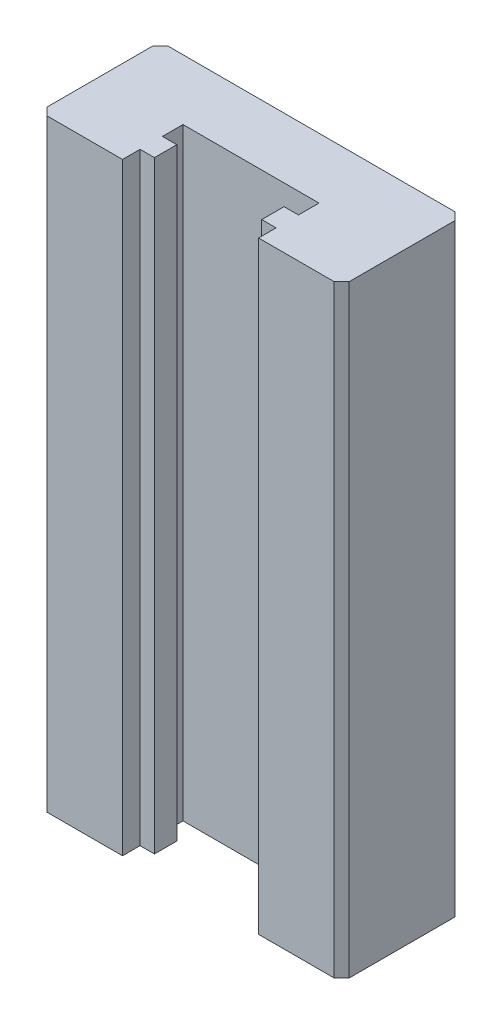
ISO-10303-21;
HEADER;
FILE_DESCRIPTION(('STEP AP214'),'2;1');
FILE_NAME('part.step','',(''),(''),'','','');
FILE_SCHEMA(('AUTOMOTIVE_DESIGN { 1 0 10303 214 1 1 1 1 }'));
ENDSEC;
DATA;
#1=APPLICATION_CONTEXT('core data for automotive mechanical design processes');
#2=APPLICATION_PROTOCOL_DEFINITION('international standard','automotive_design',2000,#1);
#3=PRODUCT_CONTEXT('',#1,'mechanical');
#4=PRODUCT('Part','Part','',(#3));
#5=PRODUCT_RELATED_PRODUCT_CATEGORY('part','',(#4));
#6=PRODUCT_DEFINITION_FORMATION('','',#4);
#7=PRODUCT_DEFINITION_CONTEXT('part definition',#1,'design');
#8=PRODUCT_DEFINITION('design','',#6,#7);
#9=PRODUCT_DEFINITION_SHAPE('','',#8);
#10=(LENGTH_UNIT() NAMED_UNIT(*) SI_UNIT(.MILLI.,.METRE.));
#11=(NAMED_UNIT(*) PLANE_ANGLE_UNIT() SI_UNIT($,.RADIAN.));
#12=(NAMED_UNIT(*) SI_UNIT($,.STERADIAN.) SOLID_ANGLE_UNIT());
#13=UNCERTAINTY_MEASURE_WITH_UNIT(LENGTH_MEASURE(1.E-05),#10,'distance_accuracy_value','');
#14=(GEOMETRIC_REPRESENTATION_CONTEXT(3) GLOBAL_UNCERTAINTY_ASSIGNED_CONTEXT((#13)) GLOBAL_UNIT_ASSIGNED_CONTEXT((#10,
#11,#12)) REPRESENTATION_CONTEXT('',''));
#15=CARTESIAN_POINT('',(0.,0.,0.));
#16=DIRECTION('',(0.,0.,1.));
#17=DIRECTION('',(1.,0.,0.));
#18=AXIS2_PLACEMENT_3D('',#15,#16,#17);
#19=CARTESIAN_POINT('',(4.5,39.9,0.));
#20=DIRECTION('',(-1.,0.,0.));
#21=DIRECTION('',(0.,0.,1.));
#22=AXIS2_PLACEMENT_3D('',#19,#20,#21);
#23=PLANE('',#22);
#24=DIRECTION('',(0.,0.,-1.));
#25=VECTOR('',#24,1.);
#26=CARTESIAN_POINT('',(4.5,0.,0.));
#27=LINE('',#26,#25);
#28=CARTESIAN_POINT('',(4.5,0.,1.36));
#29=VERTEX_POINT('',#28);
#30=CARTESIAN_POINT('',(4.5,0.,0.));
#31=VERTEX_POINT('',#30);
#32=EDGE_CURVE('E191',#29,#31,#27,.T.);
#33=ORIENTED_EDGE('',*,*,#32,.F.);
#34=DIRECTION('',(0.,-1.,0.));
#35=VECTOR('',#34,1.);
#36=CARTESIAN_POINT('',(4.5,39.9,1.36));
#37=LINE('',#36,#35);
#38=CARTESIAN_POINT('',(4.5,39.9,1.36));
#39=VERTEX_POINT('',#38);
#40=EDGE_CURVE('E187',#39,#29,#37,.T.);
#41=ORIENTED_EDGE('',*,*,#40,.F.);
#42=DIRECTION('',(0.,0.,-1.));
#43=VECTOR('',#42,1.);
#44=CARTESIAN_POINT('',(4.5,39.9,0.));
#45=LINE('',#44,#43);
#46=CARTESIAN_POINT('',(4.5,39.9,0.));
#47=VERTEX_POINT('',#46);
#48=EDGE_CURVE('E189',#39,#47,#45,.T.);
#49=ORIENTED_EDGE('',*,*,#48,.T.);
#50=DIRECTION('',(0.,-1.,0.));
#51=VECTOR('',#50,1.);
#52=CARTESIAN_POINT('',(4.5,39.9,0.));
#53=LINE('',#52,#51);
#54=EDGE_CURVE('E260',#47,#31,#53,.T.);
#55=ORIENTED_EDGE('',*,*,#54,.T.);
#56=EDGE_LOOP('',(#33,#41,#49,#55));
#57=FACE_BOUND('',#56,.T.);
#58=ADVANCED_FACE('F47',(#57),#23,.T.);
#59=CARTESIAN_POINT('',(0.,39.9,1.36));
#60=DIRECTION('',(0.,0.,-1.));
#61=DIRECTION('',(-1.,0.,0.));
#62=AXIS2_PLACEMENT_3D('',#59,#60,#61);
#63=PLANE('',#62);
#64=DIRECTION('',(1.,0.,0.));
#65=VECTOR('',#64,1.);
#66=CARTESIAN_POINT('',(0.,0.,1.36));
#67=LINE('',#66,#65);
#68=CARTESIAN_POINT('',(3.55,0.,1.36));
#69=VERTEX_POINT('',#68);
#70=EDGE_CURVE('E263',#69,#29,#67,.T.);
#71=ORIENTED_EDGE('',*,*,#70,.F.);
#72=DIRECTION('',(0.,-1.,0.));
#73=VECTOR('',#72,1.);
#74=CARTESIAN_POINT('',(3.55,39.9,1.36));
#75=LINE('',#74,#73);
#76=CARTESIAN_POINT('',(3.55,39.9,1.36));
#77=VERTEX_POINT('',#76);
#78=EDGE_CURVE('E198',#77,#69,#75,.T.);
#79=ORIENTED_EDGE('',*,*,#78,.F.);
#80=DIRECTION('',(1.,0.,0.));
#81=VECTOR('',#80,1.);
#82=CARTESIAN_POINT('',(0.,39.9,1.36));
#83=LINE('',#82,#81);
#84=EDGE_CURVE('E204',#77,#39,#83,.T.);
#85=ORIENTED_EDGE('',*,*,#84,.T.);
#86=ORIENTED_EDGE('',*,*,#40,.T.);
#87=EDGE_LOOP('',(#71,#79,#85,#86));
#88=FACE_BOUND('',#87,.T.);
#89=ADVANCED_FACE('F212',(#88),#63,.T.);
#90=CARTESIAN_POINT('',(3.55,39.9,0.));
#91=DIRECTION('',(-1.,0.,0.));
#92=DIRECTION('',(0.,0.,1.));
#93=AXIS2_PLACEMENT_3D('',#90,#91,#92);
#94=PLANE('',#93);
#95=DIRECTION('',(0.,0.,-1.));
#96=VECTOR('',#95,1.);
#97=CARTESIAN_POINT('',(3.55,0.,0.));
#98=LINE('',#97,#96);
#99=CARTESIAN_POINT('',(3.55,0.,2.84));
#100=VERTEX_POINT('',#99);
#101=EDGE_CURVE('E267',#100,#69,#98,.T.);
#102=ORIENTED_EDGE('',*,*,#101,.F.);
#103=DIRECTION('',(0.,-1.,0.));
#104=VECTOR('',#103,1.);
#105=CARTESIAN_POINT('',(3.55,39.9,2.84));
#106=LINE('',#105,#104);
#107=CARTESIAN_POINT('',(3.55,39.9,2.84));
#108=VERTEX_POINT('',#107);
#109=EDGE_CURVE('E346',#108,#100,#106,.T.);
#110=ORIENTED_EDGE('',*,*,#109,.F.);
#111=DIRECTION('',(0.,0.,-1.));
#112=VECTOR('',#111,1.);
#113=CARTESIAN_POINT('',(3.55,39.9,0.));
#114=LINE('',#113,#112);
#115=EDGE_CURVE('E214',#108,#77,#114,.T.);
#116=ORIENTED_EDGE('',*,*,#115,.T.);
#117=ORIENTED_EDGE('',*,*,#78,.T.);
#118=EDGE_LOOP('',(#102,#110,#116,#117));
#119=FACE_BOUND('',#118,.T.);
#120=ADVANCED_FACE('F435',(#119),#94,.T.);
#121=CARTESIAN_POINT('',(0.,39.9,2.84));
#122=DIRECTION('',(0.,0.,1.));
#123=DIRECTION('',(1.,0.,0.));
#124=AXIS2_PLACEMENT_3D('',#121,#122,#123);
#125=PLANE('',#124);
#126=DIRECTION('',(-1.,0.,0.));
#127=VECTOR('',#126,1.);
#128=CARTESIAN_POINT('',(0.,0.,2.84));
#129=LINE('',#128,#127);
#130=CARTESIAN_POINT('',(4.5,0.,2.84));
#131=VERTEX_POINT('',#130);
#132=EDGE_CURVE('E271',#131,#100,#129,.T.);
#133=ORIENTED_EDGE('',*,*,#132,.F.);
#134=DIRECTION('',(0.,-1.,0.));
#135=VECTOR('',#134,1.);
#136=CARTESIAN_POINT('',(4.5,39.9,2.84));
#137=LINE('',#136,#135);
#138=CARTESIAN_POINT('',(4.5,39.9,2.84));
#139=VERTEX_POINT('',#138);
#140=EDGE_CURVE('E343',#139,#131,#137,.T.);
#141=ORIENTED_EDGE('',*,*,#140,.F.);
#142=DIRECTION('',(-1.,0.,0.));
#143=VECTOR('',#142,1.);
#144=CARTESIAN_POINT('',(0.,39.9,2.84));
#145=LINE('',#144,#143);
#146=EDGE_CURVE('E217',#139,#108,#145,.T.);
#147=ORIENTED_EDGE('',*,*,#146,.T.);
#148=ORIENTED_EDGE('',*,*,#109,.T.);
#149=EDGE_LOOP('',(#133,#141,#147,#148));
#150=FACE_BOUND('',#149,.T.);
#151=ADVANCED_FACE('F439',(#150),#125,.T.);
#152=CARTESIAN_POINT('',(4.5,39.9,0.));
#153=DIRECTION('',(-1.,0.,0.));
#154=DIRECTION('',(0.,0.,1.));
#155=AXIS2_PLACEMENT_3D('',#152,#153,#154);
#156=PLANE('',#155);
#157=DIRECTION('',(0.,0.,-1.));
#158=VECTOR('',#157,1.);
#159=CARTESIAN_POINT('',(4.5,0.,0.));
#160=LINE('',#159,#158);
#161=CARTESIAN_POINT('',(4.5,0.,4.));
#162=VERTEX_POINT('',#161);
#163=EDGE_CURVE('E275',#162,#131,#160,.T.);
#164=ORIENTED_EDGE('',*,*,#163,.F.);
#165=DIRECTION('',(0.,-1.,0.));
#166=VECTOR('',#165,1.);
#167=CARTESIAN_POINT('',(4.5,39.9,4.));
#168=LINE('',#167,#166);
#169=CARTESIAN_POINT('',(4.5,39.9,4.));
#170=VERTEX_POINT('',#169);
#171=EDGE_CURVE('E340',#170,#162,#168,.T.);
#172=ORIENTED_EDGE('',*,*,#171,.F.);
#173=DIRECTION('',(0.,0.,-1.));
#174=VECTOR('',#173,1.);
#175=CARTESIAN_POINT('',(4.5,39.9,0.));
#176=LINE('',#175,#174);
#177=EDGE_CURVE('E224',#170,#139,#176,.T.);
#178=ORIENTED_EDGE('',*,*,#177,.T.);
#179=ORIENTED_EDGE('',*,*,#140,.T.);
#180=EDGE_LOOP('',(#164,#172,#178,#179));
#181=FACE_BOUND('',#180,.T.);
#182=ADVANCED_FACE('F442',(#181),#156,.T.);
#183=CARTESIAN_POINT('',(0.,39.9,4.));
#184=DIRECTION('',(0.,0.,-1.));
#185=DIRECTION('',(-1.,0.,0.));
#186=AXIS2_PLACEMENT_3D('',#183,#184,#185);
#187=PLANE('',#186);
#188=DIRECTION('',(1.,0.,0.));
#189=VECTOR('',#188,1.);
#190=CARTESIAN_POINT('',(0.,0.,4.));
#191=LINE('',#190,#189);
#192=CARTESIAN_POINT('',(9.49999999999999,0.,4.));
#193=VERTEX_POINT('',#192);
#194=EDGE_CURVE('E279',#162,#193,#191,.T.);
#195=ORIENTED_EDGE('',*,*,#194,.T.);
#196=DIRECTION('',(0.,1.,0.));
#197=VECTOR('',#196,1.);
#198=CARTESIAN_POINT('',(9.49999999999999,39.9,4.));
#199=LINE('',#198,#197);
#200=CARTESIAN_POINT('',(9.49999999999999,39.9,4.));
#201=VERTEX_POINT('',#200);
#202=EDGE_CURVE('E391',#193,#201,#199,.T.);
#203=ORIENTED_EDGE('',*,*,#202,.T.);
#204=DIRECTION('',(1.,0.,0.));
#205=VECTOR('',#204,1.);
#206=CARTESIAN_POINT('',(0.,39.9,4.));
#207=LINE('',#206,#205);
#208=EDGE_CURVE('E228',#170,#201,#207,.T.);
#209=ORIENTED_EDGE('',*,*,#208,.F.);
#210=ORIENTED_EDGE('',*,*,#171,.T.);
#211=EDGE_LOOP('',(#195,#203,#209,#210));
#212=FACE_BOUND('',#211,.T.);
#213=ADVANCED_FACE('F494',(#212),#187,.F.);
#214=CARTESIAN_POINT('',(10.,39.9,0.));
#215=DIRECTION('',(-1.,0.,0.));
#216=DIRECTION('',(0.,0.,1.));
#217=AXIS2_PLACEMENT_3D('',#214,#215,#216);
#218=PLANE('',#217);
#219=DIRECTION('',(0.,0.,-1.));
#220=VECTOR('',#219,1.);
#221=CARTESIAN_POINT('',(10.,39.9,0.));
#222=LINE('',#221,#220);
#223=CARTESIAN_POINT('',(10.,39.9,3.49999999999999));
#224=VERTEX_POINT('',#223);
#225=CARTESIAN_POINT('',(10.,39.9,-3.5));
#226=VERTEX_POINT('',#225);
#227=EDGE_CURVE('E232',#224,#226,#222,.T.);
#228=ORIENTED_EDGE('',*,*,#227,.F.);
#229=DIRECTION('',(0.,-1.,0.));
#230=VECTOR('',#229,1.);
#231=CARTESIAN_POINT('',(10.,39.9,3.49999999999999));
#232=LINE('',#231,#230);
#233=CARTESIAN_POINT('',(10.,0.,3.49999999999999));
#234=VERTEX_POINT('',#233);
#235=EDGE_CURVE('E387',#224,#234,#232,.T.);
#236=ORIENTED_EDGE('',*,*,#235,.T.);
#237=DIRECTION('',(0.,0.,-1.));
#238=VECTOR('',#237,1.);
#239=CARTESIAN_POINT('',(10.,0.,0.));
#240=LINE('',#239,#238);
#241=CARTESIAN_POINT('',(10.,0.,-3.5));
#242=VERTEX_POINT('',#241);
#243=EDGE_CURVE('E283',#234,#242,#240,.T.);
#244=ORIENTED_EDGE('',*,*,#243,.T.);
#245=DIRECTION('',(0.,1.,0.));
#246=VECTOR('',#245,1.);
#247=CARTESIAN_POINT('',(10.,39.9,-3.5));
#248=LINE('',#247,#246);
#249=EDGE_CURVE('E384',#242,#226,#248,.T.);
#250=ORIENTED_EDGE('',*,*,#249,.T.);
#251=EDGE_LOOP('',(#228,#236,#244,#250));
#252=FACE_BOUND('',#251,.T.);
#253=ADVANCED_FACE('F453',(#252),#218,.F.);
#254=CARTESIAN_POINT('',(0.,39.9,-4.));
#255=DIRECTION('',(0.,0.,-1.));
#256=DIRECTION('',(-1.,0.,0.));
#257=AXIS2_PLACEMENT_3D('',#254,#255,#256);
#258=PLANE('',#257);
#259=CARTESIAN_POINT('',(7.5,27.95,-4.));
#260=DIRECTION('',(0.,0.,-1.));
#261=DIRECTION('',(1.,0.,0.));
#262=AXIS2_PLACEMENT_3D('',#259,#260,#261);
#263=CIRCLE('',#262,1.5);
#264=CARTESIAN_POINT('',(9.,27.95,-4.));
#265=VERTEX_POINT('',#264);
#266=EDGE_CURVE('E566',#265,#265,#263,.T.);
#267=ORIENTED_EDGE('',*,*,#266,.F.);
#268=EDGE_LOOP('',(#267));
#269=FACE_BOUND('',#268,.T.);
#270=CARTESIAN_POINT('',(-7.5,11.95,-4.));
#271=DIRECTION('',(0.,0.,-1.));
#272=DIRECTION('',(1.,0.,0.));
#273=AXIS2_PLACEMENT_3D('',#270,#271,#272);
#274=CIRCLE('',#273,1.5);
#275=CARTESIAN_POINT('',(-6.,11.95,-4.));
#276=VERTEX_POINT('',#275);
#277=EDGE_CURVE('E562',#276,#276,#274,.T.);
#278=ORIENTED_EDGE('',*,*,#277,.F.);
#279=EDGE_LOOP('',(#278));
#280=FACE_BOUND('',#279,.T.);
#281=CARTESIAN_POINT('',(7.5,11.95,-4.));
#282=DIRECTION('',(0.,0.,-1.));
#283=DIRECTION('',(-1.,0.,0.));
#284=AXIS2_PLACEMENT_3D('',#281,#282,#283);
#285=CIRCLE('',#284,1.5);
#286=CARTESIAN_POINT('',(6.,11.95,-4.));
#287=VERTEX_POINT('',#286);
#288=EDGE_CURVE('E554',#287,#287,#285,.T.);
#289=ORIENTED_EDGE('',*,*,#288,.F.);
#290=EDGE_LOOP('',(#289));
#291=FACE_BOUND('',#290,.T.);
#292=CARTESIAN_POINT('',(-7.5,27.95,-4.));
#293=DIRECTION('',(0.,0.,-1.));
#294=DIRECTION('',(-1.,0.,0.));
#295=AXIS2_PLACEMENT_3D('',#292,#293,#294);
#296=CIRCLE('',#295,1.5);
#297=CARTESIAN_POINT('',(-9.,27.95,-4.));
#298=VERTEX_POINT('',#297);
#299=EDGE_CURVE('E570',#298,#298,#296,.T.);
#300=ORIENTED_EDGE('',*,*,#299,.F.);
#301=EDGE_LOOP('',(#300));
#302=FACE_BOUND('',#301,.T.);
#303=DIRECTION('',(1.,0.,0.));
#304=VECTOR('',#303,1.);
#305=CARTESIAN_POINT('',(0.,39.9,-4.));
#306=LINE('',#305,#304);
#307=CARTESIAN_POINT('',(-9.49999999999999,39.9,-4.));
#308=VERTEX_POINT('',#307);
#309=CARTESIAN_POINT('',(9.5,39.9,-4.));
#310=VERTEX_POINT('',#309);
#311=EDGE_CURVE('E236',#308,#310,#306,.T.);
#312=ORIENTED_EDGE('',*,*,#311,.T.);
#313=DIRECTION('',(0.,-1.,0.));
#314=VECTOR('',#313,1.);
#315=CARTESIAN_POINT('',(9.5,0.,-4.));
#316=LINE('',#315,#314);
#317=CARTESIAN_POINT('',(9.5,0.,-4.));
#318=VERTEX_POINT('',#317);
#319=EDGE_CURVE('E11',#310,#318,#316,.T.);
#320=ORIENTED_EDGE('',*,*,#319,.T.);
#321=DIRECTION('',(1.,0.,0.));
#322=VECTOR('',#321,1.);
#323=CARTESIAN_POINT('',(0.,0.,-4.));
#324=LINE('',#323,#322);
#325=CARTESIAN_POINT('',(-9.49999999999999,0.,-4.));
#326=VERTEX_POINT('',#325);
#327=EDGE_CURVE('E288',#326,#318,#324,.T.);
#328=ORIENTED_EDGE('',*,*,#327,.F.);
#329=DIRECTION('',(0.,1.,0.));
#330=VECTOR('',#329,1.);
#331=CARTESIAN_POINT('',(-9.49999999999999,39.9,-4.));
#332=LINE('',#331,#330);
#333=EDGE_CURVE('E57',#326,#308,#332,.T.);
#334=ORIENTED_EDGE('',*,*,#333,.T.);
#335=EDGE_LOOP('',(#312,#320,#328,#334));
#336=FACE_BOUND('',#335,.T.);
#337=ADVANCED_FACE('F459',(#269,#280,#291,#302,#336),#258,.T.);
#338=CARTESIAN_POINT('',(-10.,39.9,0.));
#339=DIRECTION('',(-1.,0.,0.));
#340=DIRECTION('',(0.,0.,1.));
#341=AXIS2_PLACEMENT_3D('',#338,#339,#340);
#342=PLANE('',#341);
#343=DIRECTION('',(0.,0.,-1.));
#344=VECTOR('',#343,1.);
#345=CARTESIAN_POINT('',(-10.,0.,0.));
#346=LINE('',#345,#344);
#347=CARTESIAN_POINT('',(-10.,0.,3.5));
#348=VERTEX_POINT('',#347);
#349=CARTESIAN_POINT('',(-10.,0.,-3.49999999999999));
#350=VERTEX_POINT('',#349);
#351=EDGE_CURVE('E292',#348,#350,#346,.T.);
#352=ORIENTED_EDGE('',*,*,#351,.F.);
#353=DIRECTION('',(0.,1.,0.));
#354=VECTOR('',#353,1.);
#355=CARTESIAN_POINT('',(-10.,39.9,3.5));
#356=LINE('',#355,#354);
#357=CARTESIAN_POINT('',(-10.,39.9,3.5));
#358=VERTEX_POINT('',#357);
#359=EDGE_CURVE('E370',#348,#358,#356,.T.);
#360=ORIENTED_EDGE('',*,*,#359,.T.);
#361=DIRECTION('',(0.,0.,-1.));
#362=VECTOR('',#361,1.);
#363=CARTESIAN_POINT('',(-10.,39.9,0.));
#364=LINE('',#363,#362);
#365=CARTESIAN_POINT('',(-10.,39.9,-3.49999999999999));
#366=VERTEX_POINT('',#365);
#367=EDGE_CURVE('E239',#358,#366,#364,.T.);
#368=ORIENTED_EDGE('',*,*,#367,.T.);
#369=DIRECTION('',(0.,-1.,0.));
#370=VECTOR('',#369,1.);
#371=CARTESIAN_POINT('',(-10.,39.9,-3.49999999999999));
#372=LINE('',#371,#370);
#373=EDGE_CURVE('E366',#366,#350,#372,.T.);
#374=ORIENTED_EDGE('',*,*,#373,.T.);
#375=EDGE_LOOP('',(#352,#360,#368,#374));
#376=FACE_BOUND('',#375,.T.);
#377=ADVANCED_FACE('F465',(#376),#342,.T.);
#378=CARTESIAN_POINT('',(-9.5,39.9,4.));
#379=VERTEX_POINT('',#378);
#380=CARTESIAN_POINT('',(-4.5,39.9,4.));
#381=VERTEX_POINT('',#380);
#382=EDGE_CURVE('E233',#379,#381,#207,.T.);
#383=ORIENTED_EDGE('',*,*,#382,.F.);
#384=DIRECTION('',(0.,-1.,0.));
#385=VECTOR('',#384,1.);
#386=CARTESIAN_POINT('',(-9.5,0.,4.));
#387=LINE('',#386,#385);
#388=CARTESIAN_POINT('',(-9.5,0.,4.));
#389=VERTEX_POINT('',#388);
#390=EDGE_CURVE('E197',#379,#389,#387,.T.);
#391=ORIENTED_EDGE('',*,*,#390,.T.);
#392=CARTESIAN_POINT('',(-4.5,0.,4.));
#393=VERTEX_POINT('',#392);
#394=EDGE_CURVE('E284',#389,#393,#191,.T.);
#395=ORIENTED_EDGE('',*,*,#394,.T.);
#396=DIRECTION('',(0.,-1.,0.));
#397=VECTOR('',#396,1.);
#398=CARTESIAN_POINT('',(-4.5,39.9,4.));
#399=LINE('',#398,#397);
#400=EDGE_CURVE('E336',#381,#393,#399,.T.);
#401=ORIENTED_EDGE('',*,*,#400,.F.);
#402=EDGE_LOOP('',(#383,#391,#395,#401));
#403=FACE_BOUND('',#402,.T.);
#404=ADVANCED_FACE('F402',(#403),#187,.F.);
#405=CARTESIAN_POINT('',(-4.5,39.9,0.));
#406=DIRECTION('',(-1.,0.,0.));
#407=DIRECTION('',(0.,0.,1.));
#408=AXIS2_PLACEMENT_3D('',#405,#406,#407);
#409=PLANE('',#408);
#410=DIRECTION('',(0.,0.,-1.));
#411=VECTOR('',#410,1.);
#412=CARTESIAN_POINT('',(-4.5,0.,0.));
#413=LINE('',#412,#411);
#414=CARTESIAN_POINT('',(-4.5,0.,2.84));
#415=VERTEX_POINT('',#414);
#416=EDGE_CURVE('E296',#393,#415,#413,.T.);
#417=ORIENTED_EDGE('',*,*,#416,.T.);
#418=DIRECTION('',(0.,-1.,0.));
#419=VECTOR('',#418,1.);
#420=CARTESIAN_POINT('',(-4.5,39.9,2.84));
#421=LINE('',#420,#419);
#422=CARTESIAN_POINT('',(-4.5,39.9,2.84));
#423=VERTEX_POINT('',#422);
#424=EDGE_CURVE('E332',#423,#415,#421,.T.);
#425=ORIENTED_EDGE('',*,*,#424,.F.);
#426=DIRECTION('',(0.,0.,-1.));
#427=VECTOR('',#426,1.);
#428=CARTESIAN_POINT('',(-4.5,39.9,0.));
#429=LINE('',#428,#427);
#430=EDGE_CURVE('E243',#381,#423,#429,.T.);
#431=ORIENTED_EDGE('',*,*,#430,.F.);
#432=ORIENTED_EDGE('',*,*,#400,.T.);
#433=EDGE_LOOP('',(#417,#425,#431,#432));
#434=FACE_BOUND('',#433,.T.);
#435=ADVANCED_FACE('F406',(#434),#409,.F.);
#436=CARTESIAN_POINT('',(0.,39.9,2.84));
#437=DIRECTION('',(0.,0.,-1.));
#438=DIRECTION('',(-1.,0.,0.));
#439=AXIS2_PLACEMENT_3D('',#436,#437,#438);
#440=PLANE('',#439);
#441=DIRECTION('',(1.,0.,0.));
#442=VECTOR('',#441,1.);
#443=CARTESIAN_POINT('',(0.,0.,2.84));
#444=LINE('',#443,#442);
#445=CARTESIAN_POINT('',(-3.55,0.,2.84));
#446=VERTEX_POINT('',#445);
#447=EDGE_CURVE('E299',#415,#446,#444,.T.);
#448=ORIENTED_EDGE('',*,*,#447,.T.);
#449=DIRECTION('',(0.,-1.,0.));
#450=VECTOR('',#449,1.);
#451=CARTESIAN_POINT('',(-3.55,39.9,2.84));
#452=LINE('',#451,#450);
#453=CARTESIAN_POINT('',(-3.55,39.9,2.84));
#454=VERTEX_POINT('',#453);
#455=EDGE_CURVE('E328',#454,#446,#452,.T.);
#456=ORIENTED_EDGE('',*,*,#455,.F.);
#457=DIRECTION('',(1.,0.,0.));
#458=VECTOR('',#457,1.);
#459=CARTESIAN_POINT('',(0.,39.9,2.84));
#460=LINE('',#459,#458);
#461=EDGE_CURVE('E246',#423,#454,#460,.T.);
#462=ORIENTED_EDGE('',*,*,#461,.F.);
#463=ORIENTED_EDGE('',*,*,#424,.T.);
#464=EDGE_LOOP('',(#448,#456,#462,#463));
#465=FACE_BOUND('',#464,.T.);
#466=ADVANCED_FACE('F411',(#465),#440,.F.);
#467=CARTESIAN_POINT('',(-3.55,39.9,0.));
#468=DIRECTION('',(-1.,0.,0.));
#469=DIRECTION('',(0.,0.,1.));
#470=AXIS2_PLACEMENT_3D('',#467,#468,#469);
#471=PLANE('',#470);
#472=DIRECTION('',(0.,0.,-1.));
#473=VECTOR('',#472,1.);
#474=CARTESIAN_POINT('',(-3.55,0.,0.));
#475=LINE('',#474,#473);
#476=CARTESIAN_POINT('',(-3.55,0.,1.36));
#477=VERTEX_POINT('',#476);
#478=EDGE_CURVE('E302',#446,#477,#475,.T.);
#479=ORIENTED_EDGE('',*,*,#478,.T.);
#480=DIRECTION('',(0.,-1.,0.));
#481=VECTOR('',#480,1.);
#482=CARTESIAN_POINT('',(-3.55,39.9,1.36));
#483=LINE('',#482,#481);
#484=CARTESIAN_POINT('',(-3.55,39.9,1.36));
#485=VERTEX_POINT('',#484);
#486=EDGE_CURVE('E324',#485,#477,#483,.T.);
#487=ORIENTED_EDGE('',*,*,#486,.F.);
#488=DIRECTION('',(0.,0.,-1.));
#489=VECTOR('',#488,1.);
#490=CARTESIAN_POINT('',(-3.55,39.9,0.));
#491=LINE('',#490,#489);
#492=EDGE_CURVE('E249',#454,#485,#491,.T.);
#493=ORIENTED_EDGE('',*,*,#492,.F.);
#494=ORIENTED_EDGE('',*,*,#455,.T.);
#495=EDGE_LOOP('',(#479,#487,#493,#494));
#496=FACE_BOUND('',#495,.T.);
#497=ADVANCED_FACE('F417',(#496),#471,.F.);
#498=CARTESIAN_POINT('',(0.,39.9,1.36));
#499=DIRECTION('',(0.,0.,1.));
#500=DIRECTION('',(1.,0.,0.));
#501=AXIS2_PLACEMENT_3D('',#498,#499,#500);
#502=PLANE('',#501);
#503=DIRECTION('',(-1.,0.,0.));
#504=VECTOR('',#503,1.);
#505=CARTESIAN_POINT('',(0.,0.,1.36));
#506=LINE('',#505,#504);
#507=CARTESIAN_POINT('',(-4.5,0.,1.36));
#508=VERTEX_POINT('',#507);
#509=EDGE_CURVE('E305',#477,#508,#506,.T.);
#510=ORIENTED_EDGE('',*,*,#509,.T.);
#511=DIRECTION('',(0.,-1.,0.));
#512=VECTOR('',#511,1.);
#513=CARTESIAN_POINT('',(-4.5,39.9,1.36));
#514=LINE('',#513,#512);
#515=CARTESIAN_POINT('',(-4.5,39.9,1.36));
#516=VERTEX_POINT('',#515);
#517=EDGE_CURVE('E320',#516,#508,#514,.T.);
#518=ORIENTED_EDGE('',*,*,#517,.F.);
#519=DIRECTION('',(-1.,0.,0.));
#520=VECTOR('',#519,1.);
#521=CARTESIAN_POINT('',(0.,39.9,1.36));
#522=LINE('',#521,#520);
#523=EDGE_CURVE('E252',#485,#516,#522,.T.);
#524=ORIENTED_EDGE('',*,*,#523,.F.);
#525=ORIENTED_EDGE('',*,*,#486,.T.);
#526=EDGE_LOOP('',(#510,#518,#524,#525));
#527=FACE_BOUND('',#526,.T.);
#528=ADVANCED_FACE('F421',(#527),#502,.F.);
#529=CARTESIAN_POINT('',(-4.5,39.9,0.));
#530=DIRECTION('',(-1.,0.,0.));
#531=DIRECTION('',(0.,0.,1.));
#532=AXIS2_PLACEMENT_3D('',#529,#530,#531);
#533=PLANE('',#532);
#534=DIRECTION('',(0.,0.,-1.));
#535=VECTOR('',#534,1.);
#536=CARTESIAN_POINT('',(-4.5,0.,0.));
#537=LINE('',#536,#535);
#538=CARTESIAN_POINT('',(-4.5,0.,0.));
#539=VERTEX_POINT('',#538);
#540=EDGE_CURVE('E308',#508,#539,#537,.T.);
#541=ORIENTED_EDGE('',*,*,#540,.T.);
#542=DIRECTION('',(0.,-1.,0.));
#543=VECTOR('',#542,1.);
#544=CARTESIAN_POINT('',(-4.5,39.9,0.));
#545=LINE('',#544,#543);
#546=CARTESIAN_POINT('',(-4.5,39.9,0.));
#547=VERTEX_POINT('',#546);
#548=EDGE_CURVE('E316',#547,#539,#545,.T.);
#549=ORIENTED_EDGE('',*,*,#548,.F.);
#550=DIRECTION('',(0.,0.,-1.));
#551=VECTOR('',#550,1.);
#552=CARTESIAN_POINT('',(-4.5,39.9,0.));
#553=LINE('',#552,#551);
#554=EDGE_CURVE('E255',#516,#547,#553,.T.);
#555=ORIENTED_EDGE('',*,*,#554,.F.);
#556=ORIENTED_EDGE('',*,*,#517,.T.);
#557=EDGE_LOOP('',(#541,#549,#555,#556));
#558=FACE_BOUND('',#557,.T.);
#559=ADVANCED_FACE('F426',(#558),#533,.F.);
#560=CARTESIAN_POINT('',(0.,39.9,0.));
#561=DIRECTION('',(0.,0.,-1.));
#562=DIRECTION('',(-1.,0.,0.));
#563=AXIS2_PLACEMENT_3D('',#560,#561,#562);
#564=PLANE('',#563);
#565=DIRECTION('',(1.,0.,0.));
#566=VECTOR('',#565,1.);
#567=CARTESIAN_POINT('',(0.,0.,0.));
#568=LINE('',#567,#566);
#569=EDGE_CURVE('E210',#539,#31,#568,.T.);
#570=ORIENTED_EDGE('',*,*,#569,.T.);
#571=ORIENTED_EDGE('',*,*,#54,.F.);
#572=DIRECTION('',(1.,0.,0.));
#573=VECTOR('',#572,1.);
#574=CARTESIAN_POINT('',(0.,39.9,0.));
#575=LINE('',#574,#573);
#576=EDGE_CURVE('E207',#547,#47,#575,.T.);
#577=ORIENTED_EDGE('',*,*,#576,.F.);
#578=ORIENTED_EDGE('',*,*,#548,.T.);
#579=EDGE_LOOP('',(#570,#571,#577,#578));
#580=FACE_BOUND('',#579,.T.);
#581=ADVANCED_FACE('F429',(#580),#564,.F.);
#582=CARTESIAN_POINT('',(0.,39.9,0.));
#583=DIRECTION('',(0.,1.,0.));
#584=DIRECTION('',(0.,0.,1.));
#585=AXIS2_PLACEMENT_3D('',#582,#583,#584);
#586=PLANE('',#585);
#587=ORIENTED_EDGE('',*,*,#367,.F.);
#588=DIRECTION('',(0.707106781186548,0.,0.707106781186548));
#589=VECTOR('',#588,1.);
#590=CARTESIAN_POINT('',(-6.75,39.9,6.75));
#591=LINE('',#590,#589);
#592=EDGE_CURVE('E381',#358,#379,#591,.T.);
#593=ORIENTED_EDGE('',*,*,#592,.T.);
#594=ORIENTED_EDGE('',*,*,#382,.T.);
#595=ORIENTED_EDGE('',*,*,#430,.T.);
#596=ORIENTED_EDGE('',*,*,#461,.T.);
#597=ORIENTED_EDGE('',*,*,#492,.T.);
#598=ORIENTED_EDGE('',*,*,#523,.T.);
#599=ORIENTED_EDGE('',*,*,#554,.T.);
#600=ORIENTED_EDGE('',*,*,#576,.T.);
#601=ORIENTED_EDGE('',*,*,#48,.F.);
#602=ORIENTED_EDGE('',*,*,#84,.F.);
#603=ORIENTED_EDGE('',*,*,#115,.F.);
#604=ORIENTED_EDGE('',*,*,#146,.F.);
#605=ORIENTED_EDGE('',*,*,#177,.F.);
#606=ORIENTED_EDGE('',*,*,#208,.T.);
#607=DIRECTION('',(-0.707106781186548,0.,0.707106781186548));
#608=VECTOR('',#607,1.);
#609=CARTESIAN_POINT('',(6.75,39.9,6.75));
#610=LINE('',#609,#608);
#611=EDGE_CURVE('E378',#201,#224,#610,.F.);
#612=ORIENTED_EDGE('',*,*,#611,.T.);
#613=ORIENTED_EDGE('',*,*,#227,.T.);
#614=DIRECTION('',(-0.707106781186548,0.,-0.707106781186548));
#615=VECTOR('',#614,1.);
#616=CARTESIAN_POINT('',(6.75,39.9,-6.75));
#617=LINE('',#616,#615);
#618=EDGE_CURVE('E64',#226,#310,#617,.T.);
#619=ORIENTED_EDGE('',*,*,#618,.T.);
#620=ORIENTED_EDGE('',*,*,#311,.F.);
#621=DIRECTION('',(0.707106781186548,0.,-0.707106781186548));
#622=VECTOR('',#621,1.);
#623=CARTESIAN_POINT('',(-6.75,39.9,-6.75));
#624=LINE('',#623,#622);
#625=EDGE_CURVE('E373',#308,#366,#624,.F.);
#626=ORIENTED_EDGE('',*,*,#625,.T.);
#627=EDGE_LOOP('',(#587,#593,#594,#595,#596,#597,#598,#599,#600,#601,#602,#603,#604,#605,#606,
#612,#613,#619,#620,#626));
#628=FACE_BOUND('',#627,.T.);
#629=ADVANCED_FACE('F202',(#628),#586,.T.);
#630=CARTESIAN_POINT('',(0.,0.,0.));
#631=DIRECTION('',(0.,1.,0.));
#632=DIRECTION('',(0.,0.,1.));
#633=AXIS2_PLACEMENT_3D('',#630,#631,#632);
#634=PLANE('',#633);
#635=ORIENTED_EDGE('',*,*,#394,.F.);
#636=DIRECTION('',(-0.707106781186548,0.,-0.707106781186548));
#637=VECTOR('',#636,1.);
#638=CARTESIAN_POINT('',(-9.5,0.,4.));
#639=LINE('',#638,#637);
#640=EDGE_CURVE('E363',#389,#348,#639,.T.);
#641=ORIENTED_EDGE('',*,*,#640,.T.);
#642=ORIENTED_EDGE('',*,*,#351,.T.);
#643=DIRECTION('',(-0.707106781186548,0.,0.707106781186548));
#644=VECTOR('',#643,1.);
#645=CARTESIAN_POINT('',(-10.,0.,-3.49999999999999));
#646=LINE('',#645,#644);
#647=EDGE_CURVE('E354',#350,#326,#646,.F.);
#648=ORIENTED_EDGE('',*,*,#647,.T.);
#649=ORIENTED_EDGE('',*,*,#327,.T.);
#650=DIRECTION('',(0.707106781186548,0.,0.707106781186548));
#651=VECTOR('',#650,1.);
#652=CARTESIAN_POINT('',(9.5,0.,-4.));
#653=LINE('',#652,#651);
#654=EDGE_CURVE('E357',#318,#242,#653,.T.);
#655=ORIENTED_EDGE('',*,*,#654,.T.);
#656=ORIENTED_EDGE('',*,*,#243,.F.);
#657=DIRECTION('',(0.707106781186548,0.,-0.707106781186548));
#658=VECTOR('',#657,1.);
#659=CARTESIAN_POINT('',(10.,0.,3.49999999999999));
#660=LINE('',#659,#658);
#661=EDGE_CURVE('E360',#234,#193,#660,.F.);
#662=ORIENTED_EDGE('',*,*,#661,.T.);
#663=ORIENTED_EDGE('',*,*,#194,.F.);
#664=ORIENTED_EDGE('',*,*,#163,.T.);
#665=ORIENTED_EDGE('',*,*,#132,.T.);
#666=ORIENTED_EDGE('',*,*,#101,.T.);
#667=ORIENTED_EDGE('',*,*,#70,.T.);
#668=ORIENTED_EDGE('',*,*,#32,.T.);
#669=ORIENTED_EDGE('',*,*,#569,.F.);
#670=ORIENTED_EDGE('',*,*,#540,.F.);
#671=ORIENTED_EDGE('',*,*,#509,.F.);
#672=ORIENTED_EDGE('',*,*,#478,.F.);
#673=ORIENTED_EDGE('',*,*,#447,.F.);
#674=ORIENTED_EDGE('',*,*,#416,.F.);
#675=EDGE_LOOP('',(#635,#641,#642,#648,#649,#655,#656,#662,#663,#664,#665,#666,#667,#668,#669,
#670,#671,#672,#673,#674));
#676=FACE_BOUND('',#675,.T.);
#677=ADVANCED_FACE('F431',(#676),#634,.F.);
#678=CARTESIAN_POINT('',(-7.5,27.95,-1.));
#679=DIRECTION('',(0.,0.,-1.));
#680=DIRECTION('',(-1.,0.,0.));
#681=AXIS2_PLACEMENT_3D('',#678,#679,#680);
#682=CYLINDRICAL_SURFACE('',#681,1.5);
#683=CARTESIAN_POINT('',(-7.5,27.95,-1.));
#684=DIRECTION('',(0.,0.,-1.));
#685=DIRECTION('',(-1.,0.,0.));
#686=AXIS2_PLACEMENT_3D('',#683,#684,#685);
#687=CIRCLE('',#686,1.5);
#688=CARTESIAN_POINT('',(-9.,27.95,-1.));
#689=VERTEX_POINT('',#688);
#690=EDGE_CURVE('E264',#689,#689,#687,.T.);
#691=ORIENTED_EDGE('',*,*,#690,.F.);
#692=EDGE_LOOP('',(#691));
#693=FACE_BOUND('',#692,.T.);
#694=ORIENTED_EDGE('',*,*,#299,.T.);
#695=EDGE_LOOP('',(#694));
#696=FACE_BOUND('',#695,.T.);
#697=ADVANCED_FACE('F518',(#693,#696),#682,.F.);
#698=CARTESIAN_POINT('',(-7.5,27.95,-1.));
#699=DIRECTION('',(0.,0.,-1.));
#700=DIRECTION('',(-1.,0.,0.));
#701=AXIS2_PLACEMENT_3D('',#698,#699,#700);
#702=PLANE('',#701);
#703=ORIENTED_EDGE('',*,*,#690,.T.);
#704=EDGE_LOOP('',(#703));
#705=FACE_BOUND('',#704,.T.);
#706=ADVANCED_FACE('F523',(#705),#702,.T.);
#707=CARTESIAN_POINT('',(7.5,11.95,-1.));
#708=DIRECTION('',(0.,0.,-1.));
#709=DIRECTION('',(-1.,0.,0.));
#710=AXIS2_PLACEMENT_3D('',#707,#708,#709);
#711=CYLINDRICAL_SURFACE('',#710,1.5);
#712=CARTESIAN_POINT('',(7.5,11.95,-1.));
#713=DIRECTION('',(0.,0.,-1.));
#714=DIRECTION('',(-1.,0.,0.));
#715=AXIS2_PLACEMENT_3D('',#712,#713,#714);
#716=CIRCLE('',#715,1.5);
#717=CARTESIAN_POINT('',(6.,11.95,-1.));
#718=VERTEX_POINT('',#717);
#719=EDGE_CURVE('E551',#718,#718,#716,.T.);
#720=ORIENTED_EDGE('',*,*,#719,.F.);
#721=EDGE_LOOP('',(#720));
#722=FACE_BOUND('',#721,.T.);
#723=ORIENTED_EDGE('',*,*,#288,.T.);
#724=EDGE_LOOP('',(#723));
#725=FACE_BOUND('',#724,.T.);
#726=ADVANCED_FACE('F527',(#722,#725),#711,.F.);
#727=CARTESIAN_POINT('',(7.5,11.95,-1.));
#728=DIRECTION('',(0.,0.,-1.));
#729=DIRECTION('',(-1.,0.,0.));
#730=AXIS2_PLACEMENT_3D('',#727,#728,#729);
#731=PLANE('',#730);
#732=ORIENTED_EDGE('',*,*,#719,.T.);
#733=EDGE_LOOP('',(#732));
#734=FACE_BOUND('',#733,.T.);
#735=ADVANCED_FACE('F535',(#734),#731,.T.);
#736=CARTESIAN_POINT('',(-7.5,11.95,-1.));
#737=DIRECTION('',(0.,0.,-1.));
#738=DIRECTION('',(-1.,0.,0.));
#739=AXIS2_PLACEMENT_3D('',#736,#737,#738);
#740=CYLINDRICAL_SURFACE('',#739,1.5);
#741=CARTESIAN_POINT('',(-7.5,11.95,-1.));
#742=DIRECTION('',(0.,0.,-1.));
#743=DIRECTION('',(1.,0.,0.));
#744=AXIS2_PLACEMENT_3D('',#741,#742,#743);
#745=CIRCLE('',#744,1.5);
#746=CARTESIAN_POINT('',(-6.,11.95,-1.));
#747=VERTEX_POINT('',#746);
#748=EDGE_CURVE('E557',#747,#747,#745,.T.);
#749=ORIENTED_EDGE('',*,*,#748,.F.);
#750=EDGE_LOOP('',(#749));
#751=FACE_BOUND('',#750,.T.);
#752=ORIENTED_EDGE('',*,*,#277,.T.);
#753=EDGE_LOOP('',(#752));
#754=FACE_BOUND('',#753,.T.);
#755=ADVANCED_FACE('F532',(#751,#754),#740,.F.);
#756=CARTESIAN_POINT('',(-7.5,11.95,-1.));
#757=DIRECTION('',(0.,0.,1.));
#758=DIRECTION('',(1.,0.,0.));
#759=AXIS2_PLACEMENT_3D('',#756,#757,#758);
#760=PLANE('',#759);
#761=ORIENTED_EDGE('',*,*,#748,.T.);
#762=EDGE_LOOP('',(#761));
#763=FACE_BOUND('',#762,.T.);
#764=ADVANCED_FACE('F529',(#763),#760,.F.);
#765=CARTESIAN_POINT('',(7.5,27.95,-1.));
#766=DIRECTION('',(0.,0.,-1.));
#767=DIRECTION('',(-1.,0.,0.));
#768=AXIS2_PLACEMENT_3D('',#765,#766,#767);
#769=CYLINDRICAL_SURFACE('',#768,1.5);
#770=CARTESIAN_POINT('',(7.5,27.95,-1.));
#771=DIRECTION('',(0.,0.,-1.));
#772=DIRECTION('',(1.,0.,0.));
#773=AXIS2_PLACEMENT_3D('',#770,#771,#772);
#774=CIRCLE('',#773,1.5);
#775=CARTESIAN_POINT('',(9.,27.95,-1.));
#776=VERTEX_POINT('',#775);
#777=EDGE_CURVE('E571',#776,#776,#774,.T.);
#778=ORIENTED_EDGE('',*,*,#777,.F.);
#779=EDGE_LOOP('',(#778));
#780=FACE_BOUND('',#779,.T.);
#781=ORIENTED_EDGE('',*,*,#266,.T.);
#782=EDGE_LOOP('',(#781));
#783=FACE_BOUND('',#782,.T.);
#784=ADVANCED_FACE('F477',(#780,#783),#769,.F.);
#785=CARTESIAN_POINT('',(7.5,27.95,-1.));
#786=DIRECTION('',(0.,0.,1.));
#787=DIRECTION('',(1.,0.,0.));
#788=AXIS2_PLACEMENT_3D('',#785,#786,#787);
#789=PLANE('',#788);
#790=ORIENTED_EDGE('',*,*,#777,.T.);
#791=EDGE_LOOP('',(#790));
#792=FACE_BOUND('',#791,.T.);
#793=ADVANCED_FACE('F470',(#792),#789,.F.);
#794=CARTESIAN_POINT('',(-9.5,39.9,4.));
#795=DIRECTION('',(-0.707106781186547,0.,0.707106781186547));
#796=DIRECTION('',(0.,1.,0.));
#797=AXIS2_PLACEMENT_3D('',#794,#795,#796);
#798=PLANE('',#797);
#799=ORIENTED_EDGE('',*,*,#592,.F.);
#800=ORIENTED_EDGE('',*,*,#359,.F.);
#801=ORIENTED_EDGE('',*,*,#640,.F.);
#802=ORIENTED_EDGE('',*,*,#390,.F.);
#803=EDGE_LOOP('',(#799,#800,#801,#802));
#804=FACE_BOUND('',#803,.T.);
#805=ADVANCED_FACE('F468',(#804),#798,.T.);
#806=CARTESIAN_POINT('',(10.,39.9,3.49999999999999));
#807=DIRECTION('',(-0.707106781186547,0.,-0.707106781186547));
#808=DIRECTION('',(0.,-1.,0.));
#809=AXIS2_PLACEMENT_3D('',#806,#807,#808);
#810=PLANE('',#809);
#811=ORIENTED_EDGE('',*,*,#611,.F.);
#812=ORIENTED_EDGE('',*,*,#202,.F.);
#813=ORIENTED_EDGE('',*,*,#661,.F.);
#814=ORIENTED_EDGE('',*,*,#235,.F.);
#815=EDGE_LOOP('',(#811,#812,#813,#814));
#816=FACE_BOUND('',#815,.T.);
#817=ADVANCED_FACE('F450',(#816),#810,.F.);
#818=CARTESIAN_POINT('',(9.5,39.9,-4.));
#819=DIRECTION('',(0.707106781186547,0.,-0.707106781186547));
#820=DIRECTION('',(0.,1.,0.));
#821=AXIS2_PLACEMENT_3D('',#818,#819,#820);
#822=PLANE('',#821);
#823=ORIENTED_EDGE('',*,*,#618,.F.);
#824=ORIENTED_EDGE('',*,*,#249,.F.);
#825=ORIENTED_EDGE('',*,*,#654,.F.);
#826=ORIENTED_EDGE('',*,*,#319,.F.);
#827=EDGE_LOOP('',(#823,#824,#825,#826));
#828=FACE_BOUND('',#827,.T.);
#829=ADVANCED_FACE('F458',(#828),#822,.T.);
#830=CARTESIAN_POINT('',(-10.,39.9,-3.49999999999999));
#831=DIRECTION('',(0.707106781186547,0.,0.707106781186547));
#832=DIRECTION('',(0.,-1.,0.));
#833=AXIS2_PLACEMENT_3D('',#830,#831,#832);
#834=PLANE('',#833);
#835=ORIENTED_EDGE('',*,*,#625,.F.);
#836=ORIENTED_EDGE('',*,*,#333,.F.);
#837=ORIENTED_EDGE('',*,*,#647,.F.);
#838=ORIENTED_EDGE('',*,*,#373,.F.);
#839=EDGE_LOOP('',(#835,#836,#837,#838));
#840=FACE_BOUND('',#839,.T.);
#841=ADVANCED_FACE('F50',(#840),#834,.F.);
#842=CLOSED_SHELL('',(#58,#89,#120,#151,#182,#213,#253,#337,#377,#404,#435,#466,#497,#528,#559,
#581,#629,#677,#697,#706,#726,#735,#755,#764,#784,#793,#805,#817,#829,#841));
#843=MANIFOLD_SOLID_BREP('B2',#842);
#844=ADVANCED_BREP_SHAPE_REPRESENTATION('',(#18,#843),#14);
#845=SHAPE_DEFINITION_REPRESENTATION(#9,#844);
ENDSEC;
END-ISO-10303-21;
